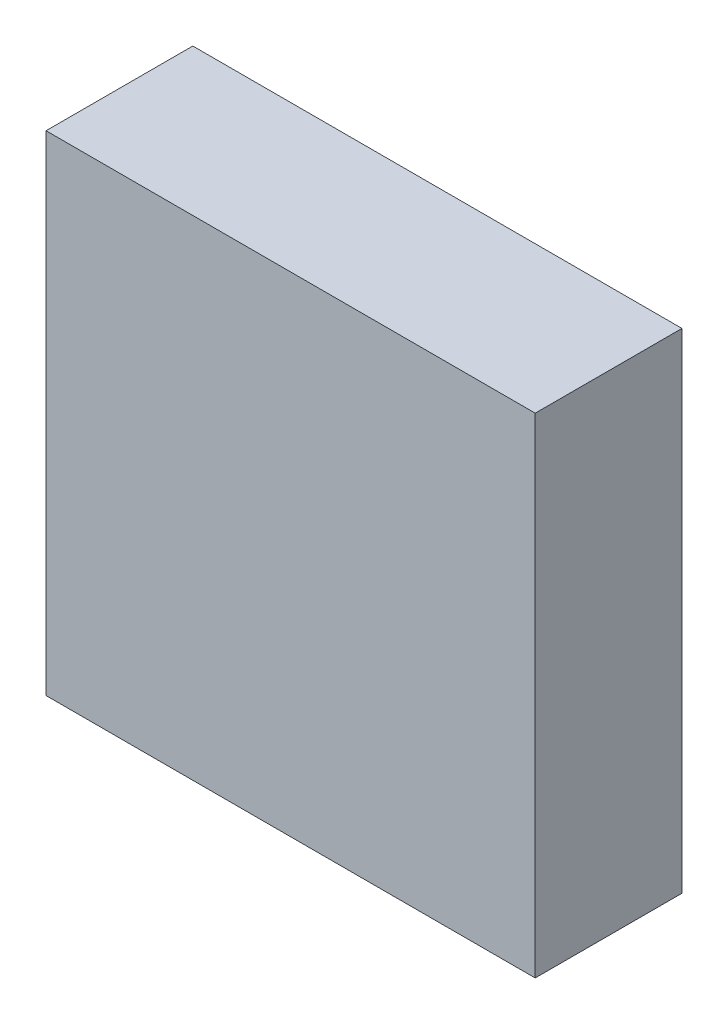
ISO-10303-21;
HEADER;
FILE_DESCRIPTION(('STEP AP214'),'2;1');
FILE_NAME('part.step','',(''),(''),'','','');
FILE_SCHEMA(('AUTOMOTIVE_DESIGN { 1 0 10303 214 1 1 1 1 }'));
ENDSEC;
DATA;
#1=APPLICATION_CONTEXT('core data for automotive mechanical design processes');
#2=APPLICATION_PROTOCOL_DEFINITION('international standard','automotive_design',2000,#1);
#3=PRODUCT_CONTEXT('',#1,'mechanical');
#4=PRODUCT('Part','Part','',(#3));
#5=PRODUCT_RELATED_PRODUCT_CATEGORY('part','',(#4));
#6=PRODUCT_DEFINITION_FORMATION('','',#4);
#7=PRODUCT_DEFINITION_CONTEXT('part definition',#1,'design');
#8=PRODUCT_DEFINITION('design','',#6,#7);
#9=PRODUCT_DEFINITION_SHAPE('','',#8);
#10=(LENGTH_UNIT() NAMED_UNIT(*) SI_UNIT(.MILLI.,.METRE.));
#11=(NAMED_UNIT(*) PLANE_ANGLE_UNIT() SI_UNIT($,.RADIAN.));
#12=(NAMED_UNIT(*) SI_UNIT($,.STERADIAN.) SOLID_ANGLE_UNIT());
#13=UNCERTAINTY_MEASURE_WITH_UNIT(LENGTH_MEASURE(1.E-05),#10,'distance_accuracy_value','');
#14=(GEOMETRIC_REPRESENTATION_CONTEXT(3) GLOBAL_UNCERTAINTY_ASSIGNED_CONTEXT((#13)) GLOBAL_UNIT_ASSIGNED_CONTEXT((#10,
#11,#12)) REPRESENTATION_CONTEXT('',''));
#15=CARTESIAN_POINT('',(0.,0.,0.));
#16=DIRECTION('',(0.,0.,1.));
#17=DIRECTION('',(1.,0.,0.));
#18=AXIS2_PLACEMENT_3D('',#15,#16,#17);
#19=CARTESIAN_POINT('',(0.,0.,3.));
#20=DIRECTION('',(1.,0.,0.));
#21=DIRECTION('',(0.,0.,-1.));
#22=AXIS2_PLACEMENT_3D('',#19,#20,#21);
#23=PLANE('',#22);
#24=DIRECTION('',(0.,-1.,0.));
#25=VECTOR('',#24,1.);
#26=CARTESIAN_POINT('',(0.,0.,0.));
#27=LINE('',#26,#25);
#28=CARTESIAN_POINT('',(0.,10.,0.));
#29=VERTEX_POINT('',#28);
#30=CARTESIAN_POINT('',(0.,0.,0.));
#31=VERTEX_POINT('',#30);
#32=EDGE_CURVE('E96',#29,#31,#27,.T.);
#33=ORIENTED_EDGE('',*,*,#32,.T.);
#34=DIRECTION('',(0.,0.,-1.));
#35=VECTOR('',#34,1.);
#36=CARTESIAN_POINT('',(0.,0.,3.));
#37=LINE('',#36,#35);
#38=CARTESIAN_POINT('',(0.,0.,3.));
#39=VERTEX_POINT('',#38);
#40=EDGE_CURVE('E11',#39,#31,#37,.T.);
#41=ORIENTED_EDGE('',*,*,#40,.F.);
#42=DIRECTION('',(0.,-1.,0.));
#43=VECTOR('',#42,1.);
#44=CARTESIAN_POINT('',(0.,0.,3.));
#45=LINE('',#44,#43);
#46=CARTESIAN_POINT('',(0.,10.,3.));
#47=VERTEX_POINT('',#46);
#48=EDGE_CURVE('E84',#47,#39,#45,.T.);
#49=ORIENTED_EDGE('',*,*,#48,.F.);
#50=DIRECTION('',(0.,0.,-1.));
#51=VECTOR('',#50,1.);
#52=CARTESIAN_POINT('',(0.,10.,3.));
#53=LINE('',#52,#51);
#54=EDGE_CURVE('E92',#47,#29,#53,.T.);
#55=ORIENTED_EDGE('',*,*,#54,.T.);
#56=EDGE_LOOP('',(#33,#41,#49,#55));
#57=FACE_BOUND('',#56,.T.);
#58=ADVANCED_FACE('F33',(#57),#23,.F.);
#59=CARTESIAN_POINT('',(0.,0.,3.));
#60=DIRECTION('',(0.,1.,0.));
#61=DIRECTION('',(0.,0.,1.));
#62=AXIS2_PLACEMENT_3D('',#59,#60,#61);
#63=PLANE('',#62);
#64=DIRECTION('',(1.,0.,0.));
#65=VECTOR('',#64,1.);
#66=CARTESIAN_POINT('',(0.,0.,0.));
#67=LINE('',#66,#65);
#68=CARTESIAN_POINT('',(10.,0.,0.));
#69=VERTEX_POINT('',#68);
#70=EDGE_CURVE('E88',#31,#69,#67,.T.);
#71=ORIENTED_EDGE('',*,*,#70,.T.);
#72=DIRECTION('',(0.,0.,-1.));
#73=VECTOR('',#72,1.);
#74=CARTESIAN_POINT('',(10.,0.,3.));
#75=LINE('',#74,#73);
#76=CARTESIAN_POINT('',(10.,0.,3.));
#77=VERTEX_POINT('',#76);
#78=EDGE_CURVE('E41',#77,#69,#75,.T.);
#79=ORIENTED_EDGE('',*,*,#78,.F.);
#80=DIRECTION('',(1.,0.,0.));
#81=VECTOR('',#80,1.);
#82=CARTESIAN_POINT('',(0.,0.,3.));
#83=LINE('',#82,#81);
#84=EDGE_CURVE('E79',#39,#77,#83,.T.);
#85=ORIENTED_EDGE('',*,*,#84,.F.);
#86=ORIENTED_EDGE('',*,*,#40,.T.);
#87=EDGE_LOOP('',(#71,#79,#85,#86));
#88=FACE_BOUND('',#87,.T.);
#89=ADVANCED_FACE('F87',(#88),#63,.F.);
#90=CARTESIAN_POINT('',(10.,0.,3.));
#91=DIRECTION('',(-1.,0.,0.));
#92=DIRECTION('',(0.,0.,1.));
#93=AXIS2_PLACEMENT_3D('',#90,#91,#92);
#94=PLANE('',#93);
#95=DIRECTION('',(0.,1.,0.));
#96=VECTOR('',#95,1.);
#97=CARTESIAN_POINT('',(10.,0.,0.));
#98=LINE('',#97,#96);
#99=CARTESIAN_POINT('',(10.,10.,0.));
#100=VERTEX_POINT('',#99);
#101=EDGE_CURVE('E66',#69,#100,#98,.T.);
#102=ORIENTED_EDGE('',*,*,#101,.T.);
#103=DIRECTION('',(0.,0.,-1.));
#104=VECTOR('',#103,1.);
#105=CARTESIAN_POINT('',(10.,10.,3.));
#106=LINE('',#105,#104);
#107=CARTESIAN_POINT('',(10.,10.,3.));
#108=VERTEX_POINT('',#107);
#109=EDGE_CURVE('E89',#108,#100,#106,.T.);
#110=ORIENTED_EDGE('',*,*,#109,.F.);
#111=DIRECTION('',(0.,1.,0.));
#112=VECTOR('',#111,1.);
#113=CARTESIAN_POINT('',(10.,0.,3.));
#114=LINE('',#113,#112);
#115=EDGE_CURVE('E82',#77,#108,#114,.T.);
#116=ORIENTED_EDGE('',*,*,#115,.F.);
#117=ORIENTED_EDGE('',*,*,#78,.T.);
#118=EDGE_LOOP('',(#102,#110,#116,#117));
#119=FACE_BOUND('',#118,.T.);
#120=ADVANCED_FACE('F90',(#119),#94,.F.);
#121=CARTESIAN_POINT('',(0.,10.,3.));
#122=DIRECTION('',(0.,-1.,0.));
#123=DIRECTION('',(0.,0.,-1.));
#124=AXIS2_PLACEMENT_3D('',#121,#122,#123);
#125=PLANE('',#124);
#126=DIRECTION('',(-1.,0.,0.));
#127=VECTOR('',#126,1.);
#128=CARTESIAN_POINT('',(0.,10.,0.));
#129=LINE('',#128,#127);
#130=EDGE_CURVE('E72',#100,#29,#129,.T.);
#131=ORIENTED_EDGE('',*,*,#130,.T.);
#132=ORIENTED_EDGE('',*,*,#54,.F.);
#133=DIRECTION('',(-1.,0.,0.));
#134=VECTOR('',#133,1.);
#135=CARTESIAN_POINT('',(0.,10.,3.));
#136=LINE('',#135,#134);
#137=EDGE_CURVE('E49',#108,#47,#136,.T.);
#138=ORIENTED_EDGE('',*,*,#137,.F.);
#139=ORIENTED_EDGE('',*,*,#109,.T.);
#140=EDGE_LOOP('',(#131,#132,#138,#139));
#141=FACE_BOUND('',#140,.T.);
#142=ADVANCED_FACE('F103',(#141),#125,.F.);
#143=CARTESIAN_POINT('',(0.,0.,3.));
#144=DIRECTION('',(0.,0.,-1.));
#145=DIRECTION('',(-1.,0.,0.));
#146=AXIS2_PLACEMENT_3D('',#143,#144,#145);
#147=PLANE('',#146);
#148=ORIENTED_EDGE('',*,*,#48,.T.);
#149=ORIENTED_EDGE('',*,*,#84,.T.);
#150=ORIENTED_EDGE('',*,*,#115,.T.);
#151=ORIENTED_EDGE('',*,*,#137,.T.);
#152=EDGE_LOOP('',(#148,#149,#150,#151));
#153=FACE_BOUND('',#152,.T.);
#154=ADVANCED_FACE('F80',(#153),#147,.F.);
#155=CARTESIAN_POINT('',(0.,0.,0.));
#156=DIRECTION('',(0.,0.,-1.));
#157=DIRECTION('',(-1.,0.,0.));
#158=AXIS2_PLACEMENT_3D('',#155,#156,#157);
#159=PLANE('',#158);
#160=ORIENTED_EDGE('',*,*,#32,.F.);
#161=ORIENTED_EDGE('',*,*,#130,.F.);
#162=ORIENTED_EDGE('',*,*,#101,.F.);
#163=ORIENTED_EDGE('',*,*,#70,.F.);
#164=EDGE_LOOP('',(#160,#161,#162,#163));
#165=FACE_BOUND('',#164,.T.);
#166=ADVANCED_FACE('F106',(#165),#159,.T.);
#167=CLOSED_SHELL('',(#58,#89,#120,#142,#154,#166));
#168=MANIFOLD_SOLID_BREP('B2',#167);
#169=ADVANCED_BREP_SHAPE_REPRESENTATION('',(#18,#168),#14);
#170=SHAPE_DEFINITION_REPRESENTATION(#9,#169);
ENDSEC;
END-ISO-10303-21;
